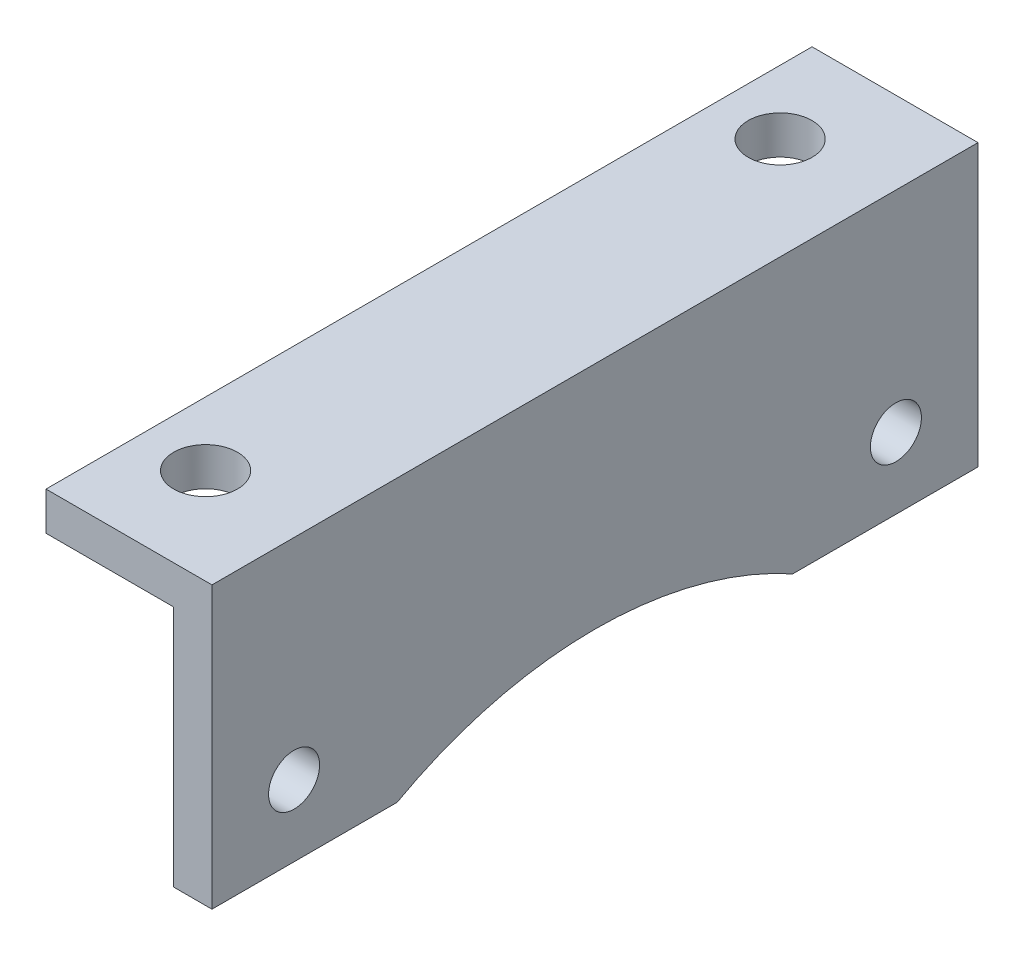
ISO-10303-21;
HEADER;
FILE_DESCRIPTION(('STEP AP214'),'2;1');
FILE_NAME('part.step','',(''),(''),'','','');
FILE_SCHEMA(('AUTOMOTIVE_DESIGN { 1 0 10303 214 1 1 1 1 }'));
ENDSEC;
DATA;
#1=APPLICATION_CONTEXT('core data for automotive mechanical design processes');
#2=APPLICATION_PROTOCOL_DEFINITION('international standard','automotive_design',2000,#1);
#3=PRODUCT_CONTEXT('',#1,'mechanical');
#4=PRODUCT('Part','Part','',(#3));
#5=PRODUCT_RELATED_PRODUCT_CATEGORY('part','',(#4));
#6=PRODUCT_DEFINITION_FORMATION('','',#4);
#7=PRODUCT_DEFINITION_CONTEXT('part definition',#1,'design');
#8=PRODUCT_DEFINITION('design','',#6,#7);
#9=PRODUCT_DEFINITION_SHAPE('','',#8);
#10=(LENGTH_UNIT() NAMED_UNIT(*) SI_UNIT(.MILLI.,.METRE.));
#11=(NAMED_UNIT(*) PLANE_ANGLE_UNIT() SI_UNIT($,.RADIAN.));
#12=(NAMED_UNIT(*) SI_UNIT($,.STERADIAN.) SOLID_ANGLE_UNIT());
#13=UNCERTAINTY_MEASURE_WITH_UNIT(LENGTH_MEASURE(1.E-05),#10,'distance_accuracy_value','');
#14=(GEOMETRIC_REPRESENTATION_CONTEXT(3) GLOBAL_UNCERTAINTY_ASSIGNED_CONTEXT((#13)) GLOBAL_UNIT_ASSIGNED_CONTEXT((#10,
#11,#12)) REPRESENTATION_CONTEXT('',''));
#15=CARTESIAN_POINT('',(0.,0.,0.));
#16=DIRECTION('',(0.,0.,1.));
#17=DIRECTION('',(1.,0.,0.));
#18=AXIS2_PLACEMENT_3D('',#15,#16,#17);
#19=CARTESIAN_POINT('',(0.,-10.5,0.));
#20=DIRECTION('',(0.,-1.,0.));
#21=DIRECTION('',(0.,0.,-1.));
#22=AXIS2_PLACEMENT_3D('',#19,#20,#21);
#23=PLANE('',#22);
#24=DIRECTION('',(-1.,0.,0.));
#25=VECTOR('',#24,1.);
#26=CARTESIAN_POINT('',(8.00000000000001,-10.5,15.4919333848297));
#27=LINE('',#26,#25);
#28=CARTESIAN_POINT('',(8.00000000000001,-10.5,15.4919333848297));
#29=VERTEX_POINT('',#28);
#30=CARTESIAN_POINT('',(5.00000000000001,-10.5,15.4919333848297));
#31=VERTEX_POINT('',#30);
#32=EDGE_CURVE('E11',#29,#31,#27,.T.);
#33=ORIENTED_EDGE('',*,*,#32,.F.);
#34=DIRECTION('',(0.,0.,-1.));
#35=VECTOR('',#34,1.);
#36=CARTESIAN_POINT('',(8.,-10.5,-30.));
#37=LINE('',#36,#35);
#38=CARTESIAN_POINT('',(8.00000000000001,-10.5,30.));
#39=VERTEX_POINT('',#38);
#40=EDGE_CURVE('E147',#39,#29,#37,.T.);
#41=ORIENTED_EDGE('',*,*,#40,.F.);
#42=DIRECTION('',(1.,0.,0.));
#43=VECTOR('',#42,1.);
#44=CARTESIAN_POINT('',(8.00000000000001,-10.5,30.));
#45=LINE('',#44,#43);
#46=CARTESIAN_POINT('',(5.00000000000001,-10.5,30.));
#47=VERTEX_POINT('',#46);
#48=EDGE_CURVE('E154',#47,#39,#45,.T.);
#49=ORIENTED_EDGE('',*,*,#48,.F.);
#50=DIRECTION('',(0.,0.,1.));
#51=VECTOR('',#50,1.);
#52=CARTESIAN_POINT('',(5.00000000000001,-10.5,30.));
#53=LINE('',#52,#51);
#54=EDGE_CURVE('E148',#31,#47,#53,.T.);
#55=ORIENTED_EDGE('',*,*,#54,.F.);
#56=EDGE_LOOP('',(#33,#41,#49,#55));
#57=FACE_BOUND('',#56,.T.);
#58=ADVANCED_FACE('F37',(#57),#23,.T.);
#59=CARTESIAN_POINT('',(-5.,1.5,-30.));
#60=DIRECTION('',(0.,0.,1.));
#61=DIRECTION('',(1.,0.,0.));
#62=AXIS2_PLACEMENT_3D('',#59,#60,#61);
#63=PLANE('',#62);
#64=DIRECTION('',(0.,1.,0.));
#65=VECTOR('',#64,1.);
#66=CARTESIAN_POINT('',(5.,-10.5,-30.));
#67=LINE('',#66,#65);
#68=CARTESIAN_POINT('',(5.,-10.5,-30.));
#69=VERTEX_POINT('',#68);
#70=CARTESIAN_POINT('',(5.,8.5,-30.));
#71=VERTEX_POINT('',#70);
#72=EDGE_CURVE('E60',#69,#71,#67,.T.);
#73=ORIENTED_EDGE('',*,*,#72,.T.);
#74=DIRECTION('',(1.,0.,0.));
#75=VECTOR('',#74,1.);
#76=CARTESIAN_POINT('',(-5.,8.5,-30.));
#77=LINE('',#76,#75);
#78=CARTESIAN_POINT('',(-5.,8.5,-30.));
#79=VERTEX_POINT('',#78);
#80=EDGE_CURVE('E113',#79,#71,#77,.T.);
#81=ORIENTED_EDGE('',*,*,#80,.F.);
#82=DIRECTION('',(0.,-1.,0.));
#83=VECTOR('',#82,1.);
#84=CARTESIAN_POINT('',(-5.,1.5,-30.));
#85=LINE('',#84,#83);
#86=CARTESIAN_POINT('',(-5.,11.5,-30.));
#87=VERTEX_POINT('',#86);
#88=EDGE_CURVE('E121',#87,#79,#85,.T.);
#89=ORIENTED_EDGE('',*,*,#88,.F.);
#90=DIRECTION('',(1.,0.,0.));
#91=VECTOR('',#90,1.);
#92=CARTESIAN_POINT('',(8.,11.5,-30.));
#93=LINE('',#92,#91);
#94=CARTESIAN_POINT('',(8.,11.5,-30.));
#95=VERTEX_POINT('',#94);
#96=EDGE_CURVE('E173',#87,#95,#93,.T.);
#97=ORIENTED_EDGE('',*,*,#96,.T.);
#98=DIRECTION('',(0.,1.,0.));
#99=VECTOR('',#98,1.);
#100=CARTESIAN_POINT('',(8.,-10.5,-30.));
#101=LINE('',#100,#99);
#102=CARTESIAN_POINT('',(8.,-10.5,-30.));
#103=VERTEX_POINT('',#102);
#104=EDGE_CURVE('E129',#103,#95,#101,.T.);
#105=ORIENTED_EDGE('',*,*,#104,.F.);
#106=DIRECTION('',(-1.,0.,0.));
#107=VECTOR('',#106,1.);
#108=CARTESIAN_POINT('',(5.,-10.5,-30.));
#109=LINE('',#108,#107);
#110=EDGE_CURVE('E153',#103,#69,#109,.T.);
#111=ORIENTED_EDGE('',*,*,#110,.T.);
#112=EDGE_LOOP('',(#73,#81,#89,#97,#105,#111));
#113=FACE_BOUND('',#112,.T.);
#114=ADVANCED_FACE('F39',(#113),#63,.F.);
#115=CARTESIAN_POINT('',(-5.,1.5,-30.));
#116=DIRECTION('',(1.,0.,0.));
#117=DIRECTION('',(0.,0.,-1.));
#118=AXIS2_PLACEMENT_3D('',#115,#116,#117);
#119=PLANE('',#118);
#120=ORIENTED_EDGE('',*,*,#88,.T.);
#121=DIRECTION('',(0.,0.,-1.));
#122=VECTOR('',#121,1.);
#123=CARTESIAN_POINT('',(-5.,8.5,30.));
#124=LINE('',#123,#122);
#125=CARTESIAN_POINT('',(-5.,8.5,30.));
#126=VERTEX_POINT('',#125);
#127=EDGE_CURVE('E107',#126,#79,#124,.T.);
#128=ORIENTED_EDGE('',*,*,#127,.F.);
#129=DIRECTION('',(0.,-1.,0.));
#130=VECTOR('',#129,1.);
#131=CARTESIAN_POINT('',(-4.99999999999999,1.5,30.));
#132=LINE('',#131,#130);
#133=CARTESIAN_POINT('',(-5.,11.5,30.));
#134=VERTEX_POINT('',#133);
#135=EDGE_CURVE('E119',#134,#126,#132,.T.);
#136=ORIENTED_EDGE('',*,*,#135,.F.);
#137=DIRECTION('',(0.,0.,-1.));
#138=VECTOR('',#137,1.);
#139=CARTESIAN_POINT('',(-5.,11.5,46.4012194668567));
#140=LINE('',#139,#138);
#141=EDGE_CURVE('E171',#134,#87,#140,.T.);
#142=ORIENTED_EDGE('',*,*,#141,.T.);
#143=EDGE_LOOP('',(#120,#128,#136,#142));
#144=FACE_BOUND('',#143,.T.);
#145=ADVANCED_FACE('F117',(#144),#119,.F.);
#146=CARTESIAN_POINT('',(-4.99999999999999,1.5,30.));
#147=DIRECTION('',(0.,0.,-1.));
#148=DIRECTION('',(-1.,0.,0.));
#149=AXIS2_PLACEMENT_3D('',#146,#147,#148);
#150=PLANE('',#149);
#151=DIRECTION('',(1.,0.,0.));
#152=VECTOR('',#151,1.);
#153=CARTESIAN_POINT('',(-5.,8.5,30.));
#154=LINE('',#153,#152);
#155=CARTESIAN_POINT('',(5.,8.5,30.));
#156=VERTEX_POINT('',#155);
#157=EDGE_CURVE('E103',#126,#156,#154,.T.);
#158=ORIENTED_EDGE('',*,*,#157,.T.);
#159=DIRECTION('',(0.,1.,0.));
#160=VECTOR('',#159,1.);
#161=CARTESIAN_POINT('',(5.00000000000001,-10.5,30.));
#162=LINE('',#161,#160);
#163=EDGE_CURVE('E132',#47,#156,#162,.T.);
#164=ORIENTED_EDGE('',*,*,#163,.F.);
#165=ORIENTED_EDGE('',*,*,#48,.T.);
#166=DIRECTION('',(0.,1.,0.));
#167=VECTOR('',#166,1.);
#168=CARTESIAN_POINT('',(8.00000000000001,-10.5,30.));
#169=LINE('',#168,#167);
#170=CARTESIAN_POINT('',(8.,11.5,30.));
#171=VERTEX_POINT('',#170);
#172=EDGE_CURVE('E162',#39,#171,#169,.T.);
#173=ORIENTED_EDGE('',*,*,#172,.T.);
#174=DIRECTION('',(-1.,0.,0.));
#175=VECTOR('',#174,1.);
#176=CARTESIAN_POINT('',(8.,11.5,30.));
#177=LINE('',#176,#175);
#178=EDGE_CURVE('E125',#171,#134,#177,.T.);
#179=ORIENTED_EDGE('',*,*,#178,.T.);
#180=ORIENTED_EDGE('',*,*,#135,.T.);
#181=EDGE_LOOP('',(#158,#164,#165,#173,#179,#180));
#182=FACE_BOUND('',#181,.T.);
#183=ADVANCED_FACE('F123',(#182),#150,.F.);
#184=CARTESIAN_POINT('',(0.,1.5,-22.5));
#185=DIRECTION('',(0.,-1.,0.));
#186=DIRECTION('',(0.,0.,-1.));
#187=AXIS2_PLACEMENT_3D('',#184,#185,#186);
#188=CYLINDRICAL_SURFACE('',#187,2.5);
#189=CARTESIAN_POINT('',(0.,8.5,-22.5));
#190=DIRECTION('',(0.,1.,0.));
#191=DIRECTION('',(-1.,0.,0.));
#192=AXIS2_PLACEMENT_3D('',#189,#190,#191);
#193=CIRCLE('',#192,2.5);
#194=CARTESIAN_POINT('',(-2.50000000000001,8.5,-22.5));
#195=VERTEX_POINT('',#194);
#196=EDGE_CURVE('E182',#195,#195,#193,.T.);
#197=ORIENTED_EDGE('',*,*,#196,.F.);
#198=EDGE_LOOP('',(#197));
#199=FACE_BOUND('',#198,.T.);
#200=CARTESIAN_POINT('',(0.,11.5,-22.5));
#201=DIRECTION('',(0.,-1.,0.));
#202=DIRECTION('',(0.,0.,-1.));
#203=AXIS2_PLACEMENT_3D('',#200,#201,#202);
#204=CIRCLE('',#203,2.5);
#205=CARTESIAN_POINT('',(0.,11.5,-25.));
#206=VERTEX_POINT('',#205);
#207=EDGE_CURVE('E177',#206,#206,#204,.T.);
#208=ORIENTED_EDGE('',*,*,#207,.F.);
#209=EDGE_LOOP('',(#208));
#210=FACE_BOUND('',#209,.T.);
#211=ADVANCED_FACE('F223',(#199,#210),#188,.F.);
#212=CARTESIAN_POINT('',(0.,1.5,22.5));
#213=DIRECTION('',(0.,-1.,0.));
#214=DIRECTION('',(0.,0.,-1.));
#215=AXIS2_PLACEMENT_3D('',#212,#213,#214);
#216=CYLINDRICAL_SURFACE('',#215,2.5);
#217=CARTESIAN_POINT('',(0.,8.5,22.5));
#218=DIRECTION('',(0.,1.,0.));
#219=DIRECTION('',(-1.,0.,0.));
#220=AXIS2_PLACEMENT_3D('',#217,#218,#219);
#221=CIRCLE('',#220,2.5);
#222=CARTESIAN_POINT('',(-2.5,8.5,22.5));
#223=VERTEX_POINT('',#222);
#224=EDGE_CURVE('E41',#223,#223,#221,.T.);
#225=ORIENTED_EDGE('',*,*,#224,.F.);
#226=EDGE_LOOP('',(#225));
#227=FACE_BOUND('',#226,.T.);
#228=CARTESIAN_POINT('',(0.,11.5,22.5));
#229=DIRECTION('',(0.,-1.,0.));
#230=DIRECTION('',(0.,0.,-1.));
#231=AXIS2_PLACEMENT_3D('',#228,#229,#230);
#232=CIRCLE('',#231,2.5);
#233=CARTESIAN_POINT('',(0.,11.5,20.));
#234=VERTEX_POINT('',#233);
#235=EDGE_CURVE('E179',#234,#234,#232,.T.);
#236=ORIENTED_EDGE('',*,*,#235,.F.);
#237=EDGE_LOOP('',(#236));
#238=FACE_BOUND('',#237,.T.);
#239=ADVANCED_FACE('F217',(#227,#238),#216,.F.);
#240=CARTESIAN_POINT('',(5.00000000000001,-10.5,30.));
#241=DIRECTION('',(-1.,0.,0.));
#242=DIRECTION('',(0.,0.,1.));
#243=AXIS2_PLACEMENT_3D('',#240,#241,#242);
#244=PLANE('',#243);
#245=CARTESIAN_POINT('',(5.,-4.93,23.57));
#246=DIRECTION('',(1.,0.,0.));
#247=DIRECTION('',(0.,0.,-1.));
#248=AXIS2_PLACEMENT_3D('',#245,#246,#247);
#249=CIRCLE('',#248,2.);
#250=CARTESIAN_POINT('',(5.,-4.93,21.57));
#251=VERTEX_POINT('',#250);
#252=EDGE_CURVE('E196',#251,#251,#249,.T.);
#253=ORIENTED_EDGE('',*,*,#252,.T.);
#254=EDGE_LOOP('',(#253));
#255=FACE_BOUND('',#254,.T.);
#256=CARTESIAN_POINT('',(5.,-4.93,-23.57));
#257=DIRECTION('',(-1.,0.,0.));
#258=DIRECTION('',(0.,0.,1.));
#259=AXIS2_PLACEMENT_3D('',#256,#257,#258);
#260=CIRCLE('',#259,2.);
#261=CARTESIAN_POINT('',(5.,-4.93,-21.57));
#262=VERTEX_POINT('',#261);
#263=EDGE_CURVE('E190',#262,#262,#260,.T.);
#264=ORIENTED_EDGE('',*,*,#263,.F.);
#265=EDGE_LOOP('',(#264));
#266=FACE_BOUND('',#265,.T.);
#267=CARTESIAN_POINT('',(5.,-38.5,0.));
#268=DIRECTION('',(-1.,0.,0.));
#269=DIRECTION('',(0.,0.,1.));
#270=AXIS2_PLACEMENT_3D('',#267,#268,#269);
#271=CIRCLE('',#270,32.);
#272=CARTESIAN_POINT('',(5.,-10.5,-15.4919333848297));
#273=VERTEX_POINT('',#272);
#274=EDGE_CURVE('E52',#31,#273,#271,.T.);
#275=ORIENTED_EDGE('',*,*,#274,.F.);
#276=ORIENTED_EDGE('',*,*,#54,.T.);
#277=ORIENTED_EDGE('',*,*,#163,.T.);
#278=DIRECTION('',(0.,0.,-1.));
#279=VECTOR('',#278,1.);
#280=CARTESIAN_POINT('',(5.,8.5,30.));
#281=LINE('',#280,#279);
#282=EDGE_CURVE('E109',#156,#71,#281,.T.);
#283=ORIENTED_EDGE('',*,*,#282,.T.);
#284=ORIENTED_EDGE('',*,*,#72,.F.);
#285=EDGE_CURVE('E157',#69,#273,#53,.T.);
#286=ORIENTED_EDGE('',*,*,#285,.T.);
#287=EDGE_LOOP('',(#275,#276,#277,#283,#284,#286));
#288=FACE_BOUND('',#287,.T.);
#289=ADVANCED_FACE('F163',(#255,#266,#288),#244,.T.);
#290=CARTESIAN_POINT('',(8.,-10.5,-30.));
#291=DIRECTION('',(1.,0.,0.));
#292=DIRECTION('',(0.,0.,-1.));
#293=AXIS2_PLACEMENT_3D('',#290,#291,#292);
#294=PLANE('',#293);
#295=CARTESIAN_POINT('',(8.00000000000001,-4.93,23.57));
#296=DIRECTION('',(1.,0.,0.));
#297=DIRECTION('',(0.,0.,-1.));
#298=AXIS2_PLACEMENT_3D('',#295,#296,#297);
#299=CIRCLE('',#298,2.);
#300=CARTESIAN_POINT('',(8.00000000000001,-4.93,21.57));
#301=VERTEX_POINT('',#300);
#302=EDGE_CURVE('E193',#301,#301,#299,.T.);
#303=ORIENTED_EDGE('',*,*,#302,.F.);
#304=EDGE_LOOP('',(#303));
#305=FACE_BOUND('',#304,.T.);
#306=CARTESIAN_POINT('',(8.00000000000001,-4.93,-23.57));
#307=DIRECTION('',(-1.,0.,0.));
#308=DIRECTION('',(0.,0.,1.));
#309=AXIS2_PLACEMENT_3D('',#306,#307,#308);
#310=CIRCLE('',#309,2.);
#311=CARTESIAN_POINT('',(8.00000000000001,-4.93,-21.57));
#312=VERTEX_POINT('',#311);
#313=EDGE_CURVE('E188',#312,#312,#310,.T.);
#314=ORIENTED_EDGE('',*,*,#313,.T.);
#315=EDGE_LOOP('',(#314));
#316=FACE_BOUND('',#315,.T.);
#317=CARTESIAN_POINT('',(8.00000000000001,-38.5,0.));
#318=DIRECTION('',(-1.,0.,0.));
#319=DIRECTION('',(0.,0.,1.));
#320=AXIS2_PLACEMENT_3D('',#317,#318,#319);
#321=CIRCLE('',#320,32.);
#322=CARTESIAN_POINT('',(8.00000000000001,-10.5,-15.4919333848297));
#323=VERTEX_POINT('',#322);
#324=EDGE_CURVE('E137',#29,#323,#321,.T.);
#325=ORIENTED_EDGE('',*,*,#324,.T.);
#326=EDGE_CURVE('E144',#323,#103,#37,.T.);
#327=ORIENTED_EDGE('',*,*,#326,.T.);
#328=ORIENTED_EDGE('',*,*,#104,.T.);
#329=DIRECTION('',(0.,0.,-1.));
#330=VECTOR('',#329,1.);
#331=CARTESIAN_POINT('',(8.,11.5,46.4012194668567));
#332=LINE('',#331,#330);
#333=EDGE_CURVE('E168',#171,#95,#332,.T.);
#334=ORIENTED_EDGE('',*,*,#333,.F.);
#335=ORIENTED_EDGE('',*,*,#172,.F.);
#336=ORIENTED_EDGE('',*,*,#40,.T.);
#337=EDGE_LOOP('',(#325,#327,#328,#334,#335,#336));
#338=FACE_BOUND('',#337,.T.);
#339=ADVANCED_FACE('F143',(#305,#316,#338),#294,.T.);
#340=DIRECTION('',(-1.,0.,0.));
#341=VECTOR('',#340,1.);
#342=CARTESIAN_POINT('',(8.00000000000001,-10.5,-15.4919333848297));
#343=LINE('',#342,#341);
#344=EDGE_CURVE('E46',#273,#323,#343,.F.);
#345=ORIENTED_EDGE('',*,*,#344,.F.);
#346=ORIENTED_EDGE('',*,*,#285,.F.);
#347=ORIENTED_EDGE('',*,*,#110,.F.);
#348=ORIENTED_EDGE('',*,*,#326,.F.);
#349=EDGE_LOOP('',(#345,#346,#347,#348));
#350=FACE_BOUND('',#349,.T.);
#351=ADVANCED_FACE('F151',(#350),#23,.T.);
#352=CARTESIAN_POINT('',(8.00000000000001,-38.5,0.));
#353=DIRECTION('',(-1.,0.,0.));
#354=DIRECTION('',(0.,0.,1.));
#355=AXIS2_PLACEMENT_3D('',#352,#353,#354);
#356=CYLINDRICAL_SURFACE('',#355,32.);
#357=ORIENTED_EDGE('',*,*,#32,.T.);
#358=ORIENTED_EDGE('',*,*,#274,.T.);
#359=ORIENTED_EDGE('',*,*,#344,.T.);
#360=ORIENTED_EDGE('',*,*,#324,.F.);
#361=EDGE_LOOP('',(#357,#358,#359,#360));
#362=FACE_BOUND('',#361,.T.);
#363=ADVANCED_FACE('F136',(#362),#356,.F.);
#364=CARTESIAN_POINT('',(8.,11.5,46.4012194668567));
#365=DIRECTION('',(0.,1.,0.));
#366=DIRECTION('',(0.,0.,1.));
#367=AXIS2_PLACEMENT_3D('',#364,#365,#366);
#368=PLANE('',#367);
#369=ORIENTED_EDGE('',*,*,#207,.T.);
#370=EDGE_LOOP('',(#369));
#371=FACE_BOUND('',#370,.T.);
#372=ORIENTED_EDGE('',*,*,#235,.T.);
#373=EDGE_LOOP('',(#372));
#374=FACE_BOUND('',#373,.T.);
#375=ORIENTED_EDGE('',*,*,#178,.F.);
#376=ORIENTED_EDGE('',*,*,#333,.T.);
#377=ORIENTED_EDGE('',*,*,#96,.F.);
#378=ORIENTED_EDGE('',*,*,#141,.F.);
#379=EDGE_LOOP('',(#375,#376,#377,#378));
#380=FACE_BOUND('',#379,.T.);
#381=ADVANCED_FACE('F237',(#371,#374,#380),#368,.T.);
#382=CARTESIAN_POINT('',(-5.,8.5,30.));
#383=DIRECTION('',(0.,1.,0.));
#384=DIRECTION('',(-1.,0.,0.));
#385=AXIS2_PLACEMENT_3D('',#382,#383,#384);
#386=PLANE('',#385);
#387=ORIENTED_EDGE('',*,*,#196,.T.);
#388=EDGE_LOOP('',(#387));
#389=FACE_BOUND('',#388,.T.);
#390=ORIENTED_EDGE('',*,*,#224,.T.);
#391=EDGE_LOOP('',(#390));
#392=FACE_BOUND('',#391,.T.);
#393=ORIENTED_EDGE('',*,*,#80,.T.);
#394=ORIENTED_EDGE('',*,*,#282,.F.);
#395=ORIENTED_EDGE('',*,*,#157,.F.);
#396=ORIENTED_EDGE('',*,*,#127,.T.);
#397=EDGE_LOOP('',(#393,#394,#395,#396));
#398=FACE_BOUND('',#397,.T.);
#399=ADVANCED_FACE('F106',(#389,#392,#398),#386,.F.);
#400=CARTESIAN_POINT('',(8.00000000000001,-4.93,-23.57));
#401=DIRECTION('',(-1.,0.,0.));
#402=DIRECTION('',(0.,0.,1.));
#403=AXIS2_PLACEMENT_3D('',#400,#401,#402);
#404=CYLINDRICAL_SURFACE('',#403,2.);
#405=ORIENTED_EDGE('',*,*,#313,.F.);
#406=EDGE_LOOP('',(#405));
#407=FACE_BOUND('',#406,.T.);
#408=ORIENTED_EDGE('',*,*,#263,.T.);
#409=EDGE_LOOP('',(#408));
#410=FACE_BOUND('',#409,.T.);
#411=ADVANCED_FACE('F210',(#407,#410),#404,.F.);
#412=CARTESIAN_POINT('',(8.00000000000001,-4.93,23.57));
#413=DIRECTION('',(-1.,0.,0.));
#414=DIRECTION('',(0.,0.,1.));
#415=AXIS2_PLACEMENT_3D('',#412,#413,#414);
#416=CYLINDRICAL_SURFACE('',#415,2.);
#417=ORIENTED_EDGE('',*,*,#302,.T.);
#418=EDGE_LOOP('',(#417));
#419=FACE_BOUND('',#418,.T.);
#420=ORIENTED_EDGE('',*,*,#252,.F.);
#421=EDGE_LOOP('',(#420));
#422=FACE_BOUND('',#421,.T.);
#423=ADVANCED_FACE('F202',(#419,#422),#416,.F.);
#424=CLOSED_SHELL('',(#58,#114,#145,#183,#211,#239,#289,#339,#351,#363,#381,#399,#411,#423));
#425=MANIFOLD_SOLID_BREP('B2',#424);
#426=ADVANCED_BREP_SHAPE_REPRESENTATION('',(#18,#425),#14);
#427=SHAPE_DEFINITION_REPRESENTATION(#9,#426);
ENDSEC;
END-ISO-10303-21;
